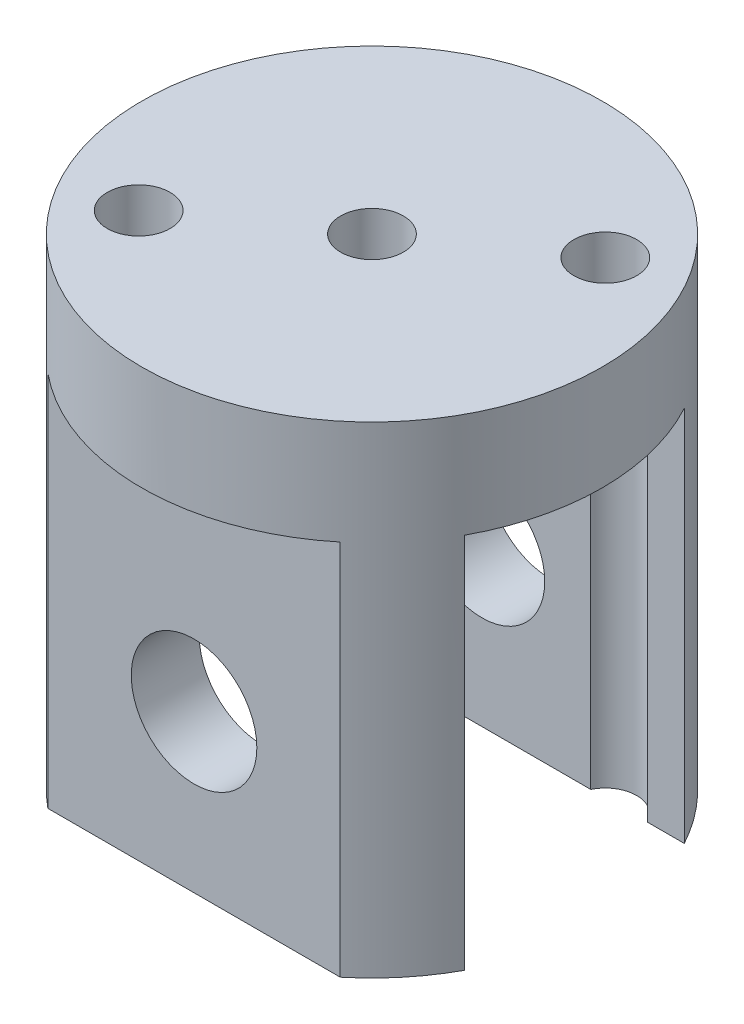
ISO-10303-21;
HEADER;
FILE_DESCRIPTION(('STEP AP214'),'2;1');
FILE_NAME('part.step','',(''),(''),'','','');
FILE_SCHEMA(('AUTOMOTIVE_DESIGN { 1 0 10303 214 1 1 1 1 }'));
ENDSEC;
DATA;
#1=APPLICATION_CONTEXT('core data for automotive mechanical design processes');
#2=APPLICATION_PROTOCOL_DEFINITION('international standard','automotive_design',2000,#1);
#3=PRODUCT_CONTEXT('',#1,'mechanical');
#4=PRODUCT('Part','Part','',(#3));
#5=PRODUCT_RELATED_PRODUCT_CATEGORY('part','',(#4));
#6=PRODUCT_DEFINITION_FORMATION('','',#4);
#7=PRODUCT_DEFINITION_CONTEXT('part definition',#1,'design');
#8=PRODUCT_DEFINITION('design','',#6,#7);
#9=PRODUCT_DEFINITION_SHAPE('','',#8);
#10=(LENGTH_UNIT() NAMED_UNIT(*) SI_UNIT(.MILLI.,.METRE.));
#11=(NAMED_UNIT(*) PLANE_ANGLE_UNIT() SI_UNIT($,.RADIAN.));
#12=(NAMED_UNIT(*) SI_UNIT($,.STERADIAN.) SOLID_ANGLE_UNIT());
#13=UNCERTAINTY_MEASURE_WITH_UNIT(LENGTH_MEASURE(1.E-05),#10,'distance_accuracy_value','');
#14=(GEOMETRIC_REPRESENTATION_CONTEXT(3) GLOBAL_UNCERTAINTY_ASSIGNED_CONTEXT((#13)) GLOBAL_UNIT_ASSIGNED_CONTEXT((#10,
#11,#12)) REPRESENTATION_CONTEXT('',''));
#15=CARTESIAN_POINT('',(0.,0.,0.));
#16=DIRECTION('',(0.,0.,1.));
#17=DIRECTION('',(1.,0.,0.));
#18=AXIS2_PLACEMENT_3D('',#15,#16,#17);
#19=CARTESIAN_POINT('',(0.,0.,-5.25));
#20=DIRECTION('',(0.,0.,-1.));
#21=DIRECTION('',(-1.,0.,0.));
#22=AXIS2_PLACEMENT_3D('',#19,#20,#21);
#23=PLANE('',#22);
#24=CARTESIAN_POINT('',(0.,7.5,-5.25));
#25=DIRECTION('',(0.,0.,-1.));
#26=DIRECTION('',(-1.,0.,0.));
#27=AXIS2_PLACEMENT_3D('',#24,#25,#26);
#28=CIRCLE('',#27,3.);
#29=CARTESIAN_POINT('',(-3.,7.5,-5.25));
#30=VERTEX_POINT('',#29);
#31=EDGE_CURVE('E168',#30,#30,#28,.T.);
#32=ORIENTED_EDGE('',*,*,#31,.T.);
#33=EDGE_LOOP('',(#32));
#34=FACE_BOUND('',#33,.T.);
#35=DIRECTION('',(-1.,0.,0.));
#36=VECTOR('',#35,1.);
#37=CARTESIAN_POINT('',(0.,0.,-5.25));
#38=LINE('',#37,#36);
#39=CARTESIAN_POINT('',(5.19803093457524,0.,-5.25));
#40=VERTEX_POINT('',#39);
#41=CARTESIAN_POINT('',(-9.6663074645906,0.,-5.25));
#42=VERTEX_POINT('',#41);
#43=EDGE_CURVE('E153',#40,#42,#38,.T.);
#44=ORIENTED_EDGE('',*,*,#43,.F.);
#45=DIRECTION('',(0.,1.,0.));
#46=VECTOR('',#45,1.);
#47=CARTESIAN_POINT('',(5.19803093457524,0.,-5.25));
#48=LINE('',#47,#46);
#49=CARTESIAN_POINT('',(5.19803093457524,18.,-5.25));
#50=VERTEX_POINT('',#49);
#51=EDGE_CURVE('E11',#40,#50,#48,.T.);
#52=ORIENTED_EDGE('',*,*,#51,.T.);
#53=DIRECTION('',(-1.,0.,0.));
#54=VECTOR('',#53,1.);
#55=CARTESIAN_POINT('',(-11.,18.,-5.25));
#56=LINE('',#55,#54);
#57=CARTESIAN_POINT('',(-9.6663074645906,18.,-5.25));
#58=VERTEX_POINT('',#57);
#59=EDGE_CURVE('E235',#50,#58,#56,.T.);
#60=ORIENTED_EDGE('',*,*,#59,.T.);
#61=DIRECTION('',(0.,-1.,0.));
#62=VECTOR('',#61,1.);
#63=CARTESIAN_POINT('',(-9.6663074645906,23.,-5.25));
#64=LINE('',#63,#62);
#65=EDGE_CURVE('E227',#42,#58,#64,.F.);
#66=ORIENTED_EDGE('',*,*,#65,.F.);
#67=EDGE_LOOP('',(#44,#52,#60,#66));
#68=FACE_BOUND('',#67,.T.);
#69=ADVANCED_FACE('F39',(#34,#68),#23,.F.);
#70=CARTESIAN_POINT('',(0.,0.,5.25));
#71=DIRECTION('',(0.,0.,-1.));
#72=DIRECTION('',(-1.,0.,0.));
#73=AXIS2_PLACEMENT_3D('',#70,#71,#72);
#74=PLANE('',#73);
#75=DIRECTION('',(0.,1.,0.));
#76=VECTOR('',#75,1.);
#77=CARTESIAN_POINT('',(-7.89794093729092,0.,5.25));
#78=LINE('',#77,#76);
#79=CARTESIAN_POINT('',(-7.89794093729092,0.,5.25));
#80=VERTEX_POINT('',#79);
#81=CARTESIAN_POINT('',(-7.89794093729092,18.,5.25));
#82=VERTEX_POINT('',#81);
#83=EDGE_CURVE('E135',#80,#82,#78,.T.);
#84=ORIENTED_EDGE('',*,*,#83,.F.);
#85=DIRECTION('',(-1.,0.,0.));
#86=VECTOR('',#85,1.);
#87=CARTESIAN_POINT('',(0.,0.,5.25));
#88=LINE('',#87,#86);
#89=CARTESIAN_POINT('',(-9.6663074645906,0.,5.25));
#90=VERTEX_POINT('',#89);
#91=EDGE_CURVE('E146',#80,#90,#88,.T.);
#92=ORIENTED_EDGE('',*,*,#91,.T.);
#93=DIRECTION('',(0.,-1.,0.));
#94=VECTOR('',#93,1.);
#95=CARTESIAN_POINT('',(-9.6663074645906,23.,5.25));
#96=LINE('',#95,#94);
#97=CARTESIAN_POINT('',(-9.6663074645906,18.,5.25));
#98=VERTEX_POINT('',#97);
#99=EDGE_CURVE('E230',#90,#98,#96,.F.);
#100=ORIENTED_EDGE('',*,*,#99,.T.);
#101=DIRECTION('',(-1.,0.,0.));
#102=VECTOR('',#101,1.);
#103=CARTESIAN_POINT('',(-11.,18.,5.25));
#104=LINE('',#103,#102);
#105=EDGE_CURVE('E236',#82,#98,#104,.T.);
#106=ORIENTED_EDGE('',*,*,#105,.F.);
#107=EDGE_LOOP('',(#84,#92,#100,#106));
#108=FACE_BOUND('',#107,.T.);
#109=ADVANCED_FACE('F295',(#108),#74,.T.);
#110=CARTESIAN_POINT('',(0.,0.,0.));
#111=DIRECTION('',(0.,1.,0.));
#112=DIRECTION('',(0.,0.,1.));
#113=AXIS2_PLACEMENT_3D('',#110,#111,#112);
#114=PLANE('',#113);
#115=ORIENTED_EDGE('',*,*,#91,.F.);
#116=CARTESIAN_POINT('',(-6.54798593593308,0.,4.59607225604892));
#117=DIRECTION('',(0.,1.,0.));
#118=DIRECTION('',(0.,0.,1.));
#119=AXIS2_PLACEMENT_3D('',#116,#117,#118);
#120=CIRCLE('',#119,1.5);
#121=CARTESIAN_POINT('',(-5.19803093457524,0.,5.25));
#122=VERTEX_POINT('',#121);
#123=EDGE_CURVE('E129',#80,#122,#120,.T.);
#124=ORIENTED_EDGE('',*,*,#123,.T.);
#125=CARTESIAN_POINT('',(9.6663074645906,0.,5.25));
#126=VERTEX_POINT('',#125);
#127=EDGE_CURVE('E143',#126,#122,#88,.T.);
#128=ORIENTED_EDGE('',*,*,#127,.F.);
#129=CARTESIAN_POINT('',(0.,0.,0.));
#130=DIRECTION('',(0.,1.,0.));
#131=DIRECTION('',(0.,0.,1.));
#132=AXIS2_PLACEMENT_3D('',#129,#130,#131);
#133=CIRCLE('',#132,11.);
#134=CARTESIAN_POINT('',(6.98212002188447,0.,8.5));
#135=VERTEX_POINT('',#134);
#136=EDGE_CURVE('E192',#135,#126,#133,.T.);
#137=ORIENTED_EDGE('',*,*,#136,.F.);
#138=DIRECTION('',(-1.,0.,0.));
#139=VECTOR('',#138,1.);
#140=CARTESIAN_POINT('',(0.,0.,8.5));
#141=LINE('',#140,#139);
#142=CARTESIAN_POINT('',(-6.98212002188447,0.,8.5));
#143=VERTEX_POINT('',#142);
#144=EDGE_CURVE('E281',#135,#143,#141,.T.);
#145=ORIENTED_EDGE('',*,*,#144,.T.);
#146=EDGE_CURVE('E195',#90,#143,#133,.T.);
#147=ORIENTED_EDGE('',*,*,#146,.F.);
#148=EDGE_LOOP('',(#115,#124,#128,#137,#145,#147));
#149=FACE_BOUND('',#148,.T.);
#150=ADVANCED_FACE('F141',(#149),#114,.F.);
#151=CARTESIAN_POINT('',(0.,23.,0.));
#152=DIRECTION('',(0.,-1.,0.));
#153=DIRECTION('',(0.,0.,-1.));
#154=AXIS2_PLACEMENT_3D('',#151,#152,#153);
#155=CYLINDRICAL_SURFACE('',#154,11.);
#156=CARTESIAN_POINT('',(0.,23.,0.));
#157=DIRECTION('',(0.,1.,0.));
#158=DIRECTION('',(0.,0.,1.));
#159=AXIS2_PLACEMENT_3D('',#156,#157,#158);
#160=CIRCLE('',#159,11.);
#161=CARTESIAN_POINT('',(0.,23.,11.));
#162=VERTEX_POINT('',#161);
#163=EDGE_CURVE('E206',#162,#162,#160,.T.);
#164=ORIENTED_EDGE('',*,*,#163,.F.);
#165=EDGE_LOOP('',(#164));
#166=FACE_BOUND('',#165,.T.);
#167=CARTESIAN_POINT('',(0.,18.,0.));
#168=DIRECTION('',(0.,1.,0.));
#169=DIRECTION('',(0.,0.,1.));
#170=AXIS2_PLACEMENT_3D('',#167,#168,#169);
#171=CIRCLE('',#170,11.);
#172=CARTESIAN_POINT('',(9.6663074645906,18.,5.25));
#173=VERTEX_POINT('',#172);
#174=CARTESIAN_POINT('',(9.6663074645906,18.,-5.25));
#175=VERTEX_POINT('',#174);
#176=EDGE_CURVE('E136',#173,#175,#171,.T.);
#177=ORIENTED_EDGE('',*,*,#176,.T.);
#178=DIRECTION('',(0.,-1.,0.));
#179=VECTOR('',#178,1.);
#180=CARTESIAN_POINT('',(9.6663074645906,23.,-5.25));
#181=LINE('',#180,#179);
#182=CARTESIAN_POINT('',(9.6663074645906,0.,-5.25));
#183=VERTEX_POINT('',#182);
#184=EDGE_CURVE('E225',#175,#183,#181,.T.);
#185=ORIENTED_EDGE('',*,*,#184,.T.);
#186=CARTESIAN_POINT('',(6.98212002188447,0.,-8.5));
#187=VERTEX_POINT('',#186);
#188=EDGE_CURVE('E186',#183,#187,#133,.T.);
#189=ORIENTED_EDGE('',*,*,#188,.T.);
#190=DIRECTION('',(0.,-1.,0.));
#191=VECTOR('',#190,1.);
#192=CARTESIAN_POINT('',(6.98212002188447,23.,-8.5));
#193=LINE('',#192,#191);
#194=CARTESIAN_POINT('',(6.98212002188447,18.,-8.5));
#195=VERTEX_POINT('',#194);
#196=EDGE_CURVE('E198',#187,#195,#193,.F.);
#197=ORIENTED_EDGE('',*,*,#196,.T.);
#198=CARTESIAN_POINT('',(0.,18.,0.));
#199=DIRECTION('',(0.,-1.,0.));
#200=DIRECTION('',(0.,0.,-1.));
#201=AXIS2_PLACEMENT_3D('',#198,#199,#200);
#202=CIRCLE('',#201,11.);
#203=CARTESIAN_POINT('',(-6.98212002188447,18.,-8.5));
#204=VERTEX_POINT('',#203);
#205=EDGE_CURVE('E211',#204,#195,#202,.T.);
#206=ORIENTED_EDGE('',*,*,#205,.F.);
#207=DIRECTION('',(0.,-1.,0.));
#208=VECTOR('',#207,1.);
#209=CARTESIAN_POINT('',(-6.98212002188447,23.,-8.5));
#210=LINE('',#209,#208);
#211=CARTESIAN_POINT('',(-6.98212002188447,0.,-8.5));
#212=VERTEX_POINT('',#211);
#213=EDGE_CURVE('E193',#204,#212,#210,.T.);
#214=ORIENTED_EDGE('',*,*,#213,.T.);
#215=EDGE_CURVE('E196',#212,#42,#133,.T.);
#216=ORIENTED_EDGE('',*,*,#215,.T.);
#217=ORIENTED_EDGE('',*,*,#65,.T.);
#218=EDGE_CURVE('E162',#58,#98,#171,.T.);
#219=ORIENTED_EDGE('',*,*,#218,.T.);
#220=ORIENTED_EDGE('',*,*,#99,.F.);
#221=ORIENTED_EDGE('',*,*,#146,.T.);
#222=DIRECTION('',(0.,-1.,0.));
#223=VECTOR('',#222,1.);
#224=CARTESIAN_POINT('',(-6.98212002188447,23.,8.5));
#225=LINE('',#224,#223);
#226=CARTESIAN_POINT('',(-6.98212002188447,18.,8.5));
#227=VERTEX_POINT('',#226);
#228=EDGE_CURVE('E220',#143,#227,#225,.F.);
#229=ORIENTED_EDGE('',*,*,#228,.T.);
#230=CARTESIAN_POINT('',(0.,18.,0.));
#231=DIRECTION('',(0.,-1.,0.));
#232=DIRECTION('',(0.,0.,-1.));
#233=AXIS2_PLACEMENT_3D('',#230,#231,#232);
#234=CIRCLE('',#233,11.);
#235=CARTESIAN_POINT('',(6.98212002188447,18.,8.5));
#236=VERTEX_POINT('',#235);
#237=EDGE_CURVE('E157',#236,#227,#234,.T.);
#238=ORIENTED_EDGE('',*,*,#237,.F.);
#239=DIRECTION('',(0.,-1.,0.));
#240=VECTOR('',#239,1.);
#241=CARTESIAN_POINT('',(6.98212002188447,23.,8.5));
#242=LINE('',#241,#240);
#243=EDGE_CURVE('E217',#236,#135,#242,.T.);
#244=ORIENTED_EDGE('',*,*,#243,.T.);
#245=ORIENTED_EDGE('',*,*,#136,.T.);
#246=DIRECTION('',(0.,-1.,0.));
#247=VECTOR('',#246,1.);
#248=CARTESIAN_POINT('',(9.6663074645906,23.,5.25));
#249=LINE('',#248,#247);
#250=EDGE_CURVE('E152',#173,#126,#249,.T.);
#251=ORIENTED_EDGE('',*,*,#250,.F.);
#252=EDGE_LOOP('',(#177,#185,#189,#197,#206,#214,#216,#217,#219,#220,#221,#229,#238,#244,#245,#251));
#253=FACE_BOUND('',#252,.T.);
#254=ADVANCED_FACE('F41',(#166,#253),#155,.T.);
#255=CARTESIAN_POINT('',(0.,23.,0.));
#256=DIRECTION('',(0.,1.,0.));
#257=DIRECTION('',(0.,0.,1.));
#258=AXIS2_PLACEMENT_3D('',#255,#256,#257);
#259=PLANE('',#258);
#260=CARTESIAN_POINT('',(-6.54798593593308,23.,4.59607225604892));
#261=DIRECTION('',(0.,1.,0.));
#262=DIRECTION('',(0.,0.,1.));
#263=AXIS2_PLACEMENT_3D('',#260,#261,#262);
#264=CIRCLE('',#263,1.5);
#265=CARTESIAN_POINT('',(-6.54798593593308,23.,6.09607225604892));
#266=VERTEX_POINT('',#265);
#267=EDGE_CURVE('E147',#266,#266,#264,.T.);
#268=ORIENTED_EDGE('',*,*,#267,.F.);
#269=EDGE_LOOP('',(#268));
#270=FACE_BOUND('',#269,.T.);
#271=CARTESIAN_POINT('',(6.54798593593308,23.,-4.59607225604892));
#272=DIRECTION('',(0.,1.,0.));
#273=DIRECTION('',(0.,0.,1.));
#274=AXIS2_PLACEMENT_3D('',#271,#272,#273);
#275=CIRCLE('',#274,1.5);
#276=CARTESIAN_POINT('',(6.54798593593308,23.,-3.09607225604892));
#277=VERTEX_POINT('',#276);
#278=EDGE_CURVE('E251',#277,#277,#275,.T.);
#279=ORIENTED_EDGE('',*,*,#278,.F.);
#280=EDGE_LOOP('',(#279));
#281=FACE_BOUND('',#280,.T.);
#282=CARTESIAN_POINT('',(0.,23.,0.));
#283=DIRECTION('',(0.,1.,0.));
#284=DIRECTION('',(0.,0.,1.));
#285=AXIS2_PLACEMENT_3D('',#282,#283,#284);
#286=CIRCLE('',#285,1.5);
#287=CARTESIAN_POINT('',(0.,23.,1.5));
#288=VERTEX_POINT('',#287);
#289=EDGE_CURVE('E172',#288,#288,#286,.T.);
#290=ORIENTED_EDGE('',*,*,#289,.F.);
#291=EDGE_LOOP('',(#290));
#292=FACE_BOUND('',#291,.T.);
#293=ORIENTED_EDGE('',*,*,#163,.T.);
#294=EDGE_LOOP('',(#293));
#295=FACE_BOUND('',#294,.T.);
#296=ADVANCED_FACE('F257',(#270,#281,#292,#295),#259,.T.);
#297=CARTESIAN_POINT('',(7.89794093729093,0.,-5.25));
#298=VERTEX_POINT('',#297);
#299=EDGE_CURVE('E155',#183,#298,#38,.T.);
#300=ORIENTED_EDGE('',*,*,#299,.T.);
#301=CARTESIAN_POINT('',(6.54798593593308,0.,-4.59607225604892));
#302=DIRECTION('',(0.,1.,0.));
#303=DIRECTION('',(0.,0.,1.));
#304=AXIS2_PLACEMENT_3D('',#301,#302,#303);
#305=CIRCLE('',#304,1.5);
#306=EDGE_CURVE('E54',#298,#40,#305,.T.);
#307=ORIENTED_EDGE('',*,*,#306,.T.);
#308=ORIENTED_EDGE('',*,*,#43,.T.);
#309=ORIENTED_EDGE('',*,*,#215,.F.);
#310=DIRECTION('',(1.,0.,0.));
#311=VECTOR('',#310,1.);
#312=CARTESIAN_POINT('',(0.,0.,-8.5));
#313=LINE('',#312,#311);
#314=EDGE_CURVE('E188',#212,#187,#313,.T.);
#315=ORIENTED_EDGE('',*,*,#314,.T.);
#316=ORIENTED_EDGE('',*,*,#188,.F.);
#317=EDGE_LOOP('',(#300,#307,#308,#309,#315,#316));
#318=FACE_BOUND('',#317,.T.);
#319=ADVANCED_FACE('F183',(#318),#114,.F.);
#320=CARTESIAN_POINT('',(-11.,18.,-11.));
#321=DIRECTION('',(0.,-1.,0.));
#322=DIRECTION('',(0.,0.,-1.));
#323=AXIS2_PLACEMENT_3D('',#320,#321,#322);
#324=PLANE('',#323);
#325=ORIENTED_EDGE('',*,*,#205,.T.);
#326=DIRECTION('',(1.,0.,0.));
#327=VECTOR('',#326,1.);
#328=CARTESIAN_POINT('',(-11.,18.,-8.5));
#329=LINE('',#328,#327);
#330=EDGE_CURVE('E214',#204,#195,#329,.T.);
#331=ORIENTED_EDGE('',*,*,#330,.F.);
#332=EDGE_LOOP('',(#325,#331));
#333=FACE_BOUND('',#332,.T.);
#334=ADVANCED_FACE('F286',(#333),#324,.T.);
#335=CARTESIAN_POINT('',(0.,0.,-8.5));
#336=DIRECTION('',(0.,0.,1.));
#337=DIRECTION('',(1.,0.,0.));
#338=AXIS2_PLACEMENT_3D('',#335,#336,#337);
#339=PLANE('',#338);
#340=CARTESIAN_POINT('',(0.,7.5,-8.5));
#341=DIRECTION('',(0.,0.,1.));
#342=DIRECTION('',(1.,0.,0.));
#343=AXIS2_PLACEMENT_3D('',#340,#341,#342);
#344=CIRCLE('',#343,3.);
#345=CARTESIAN_POINT('',(3.,7.5,-8.5));
#346=VERTEX_POINT('',#345);
#347=EDGE_CURVE('E238',#346,#346,#344,.T.);
#348=ORIENTED_EDGE('',*,*,#347,.T.);
#349=EDGE_LOOP('',(#348));
#350=FACE_BOUND('',#349,.T.);
#351=ORIENTED_EDGE('',*,*,#330,.T.);
#352=ORIENTED_EDGE('',*,*,#196,.F.);
#353=ORIENTED_EDGE('',*,*,#314,.F.);
#354=ORIENTED_EDGE('',*,*,#213,.F.);
#355=EDGE_LOOP('',(#351,#352,#353,#354));
#356=FACE_BOUND('',#355,.T.);
#357=ADVANCED_FACE('F289',(#350,#356),#339,.F.);
#358=CARTESIAN_POINT('',(-11.,18.,11.));
#359=DIRECTION('',(0.,-1.,0.));
#360=DIRECTION('',(0.,0.,-1.));
#361=AXIS2_PLACEMENT_3D('',#358,#359,#360);
#362=PLANE('',#361);
#363=DIRECTION('',(-1.,0.,0.));
#364=VECTOR('',#363,1.);
#365=CARTESIAN_POINT('',(-11.,18.,8.5));
#366=LINE('',#365,#364);
#367=EDGE_CURVE('E222',#236,#227,#366,.T.);
#368=ORIENTED_EDGE('',*,*,#367,.F.);
#369=ORIENTED_EDGE('',*,*,#237,.T.);
#370=EDGE_LOOP('',(#368,#369));
#371=FACE_BOUND('',#370,.T.);
#372=ADVANCED_FACE('F404',(#371),#362,.T.);
#373=CARTESIAN_POINT('',(0.,0.,8.5));
#374=DIRECTION('',(0.,0.,-1.));
#375=DIRECTION('',(-1.,0.,0.));
#376=AXIS2_PLACEMENT_3D('',#373,#374,#375);
#377=PLANE('',#376);
#378=CARTESIAN_POINT('',(0.,7.5,8.5));
#379=DIRECTION('',(0.,0.,1.));
#380=DIRECTION('',(1.,0.,0.));
#381=AXIS2_PLACEMENT_3D('',#378,#379,#380);
#382=CIRCLE('',#381,3.);
#383=CARTESIAN_POINT('',(3.,7.5,8.5));
#384=VERTEX_POINT('',#383);
#385=EDGE_CURVE('E169',#384,#384,#382,.T.);
#386=ORIENTED_EDGE('',*,*,#385,.F.);
#387=EDGE_LOOP('',(#386));
#388=FACE_BOUND('',#387,.T.);
#389=ORIENTED_EDGE('',*,*,#367,.T.);
#390=ORIENTED_EDGE('',*,*,#228,.F.);
#391=ORIENTED_EDGE('',*,*,#144,.F.);
#392=ORIENTED_EDGE('',*,*,#243,.F.);
#393=EDGE_LOOP('',(#389,#390,#391,#392));
#394=FACE_BOUND('',#393,.T.);
#395=ADVANCED_FACE('F275',(#388,#394),#377,.F.);
#396=CARTESIAN_POINT('',(-11.,18.,-5.25));
#397=DIRECTION('',(0.,1.,0.));
#398=DIRECTION('',(0.,0.,1.));
#399=AXIS2_PLACEMENT_3D('',#396,#397,#398);
#400=PLANE('',#399);
#401=CARTESIAN_POINT('',(0.,18.,0.));
#402=DIRECTION('',(0.,1.,0.));
#403=DIRECTION('',(0.,0.,1.));
#404=AXIS2_PLACEMENT_3D('',#401,#402,#403);
#405=CIRCLE('',#404,1.5);
#406=CARTESIAN_POINT('',(0.,18.,1.5));
#407=VERTEX_POINT('',#406);
#408=EDGE_CURVE('E170',#407,#407,#405,.T.);
#409=ORIENTED_EDGE('',*,*,#408,.T.);
#410=EDGE_LOOP('',(#409));
#411=FACE_BOUND('',#410,.T.);
#412=CARTESIAN_POINT('',(-5.19803093457524,18.,5.25));
#413=VERTEX_POINT('',#412);
#414=EDGE_CURVE('E233',#173,#413,#104,.T.);
#415=ORIENTED_EDGE('',*,*,#414,.T.);
#416=CARTESIAN_POINT('',(-6.54798593593308,18.,4.59607225604892));
#417=DIRECTION('',(0.,1.,0.));
#418=DIRECTION('',(0.,0.,1.));
#419=AXIS2_PLACEMENT_3D('',#416,#417,#418);
#420=CIRCLE('',#419,1.5);
#421=EDGE_CURVE('E62',#413,#82,#420,.T.);
#422=ORIENTED_EDGE('',*,*,#421,.T.);
#423=ORIENTED_EDGE('',*,*,#105,.T.);
#424=ORIENTED_EDGE('',*,*,#218,.F.);
#425=ORIENTED_EDGE('',*,*,#59,.F.);
#426=CARTESIAN_POINT('',(6.54798593593308,18.,-4.59607225604892));
#427=DIRECTION('',(0.,1.,0.));
#428=DIRECTION('',(0.,0.,1.));
#429=AXIS2_PLACEMENT_3D('',#426,#427,#428);
#430=CIRCLE('',#429,1.5);
#431=CARTESIAN_POINT('',(7.89794093729093,18.,-5.25));
#432=VERTEX_POINT('',#431);
#433=EDGE_CURVE('E247',#50,#432,#430,.T.);
#434=ORIENTED_EDGE('',*,*,#433,.T.);
#435=EDGE_CURVE('E179',#175,#432,#56,.T.);
#436=ORIENTED_EDGE('',*,*,#435,.F.);
#437=ORIENTED_EDGE('',*,*,#176,.F.);
#438=EDGE_LOOP('',(#415,#422,#423,#424,#425,#434,#436,#437));
#439=FACE_BOUND('',#438,.T.);
#440=ADVANCED_FACE('F272',(#411,#439),#400,.F.);
#441=ORIENTED_EDGE('',*,*,#435,.T.);
#442=DIRECTION('',(0.,1.,0.));
#443=VECTOR('',#442,1.);
#444=CARTESIAN_POINT('',(7.89794093729093,0.,-5.25));
#445=LINE('',#444,#443);
#446=EDGE_CURVE('E47',#432,#298,#445,.F.);
#447=ORIENTED_EDGE('',*,*,#446,.T.);
#448=ORIENTED_EDGE('',*,*,#299,.F.);
#449=ORIENTED_EDGE('',*,*,#184,.F.);
#450=EDGE_LOOP('',(#441,#447,#448,#449));
#451=FACE_BOUND('',#450,.T.);
#452=ADVANCED_FACE('F176',(#451),#23,.F.);
#453=DIRECTION('',(0.,1.,0.));
#454=VECTOR('',#453,1.);
#455=CARTESIAN_POINT('',(-5.19803093457524,0.,5.25));
#456=LINE('',#455,#454);
#457=EDGE_CURVE('E125',#413,#122,#456,.F.);
#458=ORIENTED_EDGE('',*,*,#457,.F.);
#459=ORIENTED_EDGE('',*,*,#414,.F.);
#460=ORIENTED_EDGE('',*,*,#250,.T.);
#461=ORIENTED_EDGE('',*,*,#127,.T.);
#462=EDGE_LOOP('',(#458,#459,#460,#461));
#463=FACE_BOUND('',#462,.T.);
#464=CARTESIAN_POINT('',(0.,7.5,5.25));
#465=DIRECTION('',(0.,0.,-1.));
#466=DIRECTION('',(-1.,0.,0.));
#467=AXIS2_PLACEMENT_3D('',#464,#465,#466);
#468=CIRCLE('',#467,3.);
#469=CARTESIAN_POINT('',(-3.,7.5,5.25));
#470=VERTEX_POINT('',#469);
#471=EDGE_CURVE('E165',#470,#470,#468,.T.);
#472=ORIENTED_EDGE('',*,*,#471,.F.);
#473=EDGE_LOOP('',(#472));
#474=FACE_BOUND('',#473,.T.);
#475=ADVANCED_FACE('F149',(#463,#474),#74,.T.);
#476=CARTESIAN_POINT('',(0.,7.5,-11.));
#477=DIRECTION('',(0.,0.,1.));
#478=DIRECTION('',(1.,0.,0.));
#479=AXIS2_PLACEMENT_3D('',#476,#477,#478);
#480=CYLINDRICAL_SURFACE('',#479,3.);
#481=ORIENTED_EDGE('',*,*,#471,.T.);
#482=EDGE_LOOP('',(#481));
#483=FACE_BOUND('',#482,.T.);
#484=ORIENTED_EDGE('',*,*,#385,.T.);
#485=EDGE_LOOP('',(#484));
#486=FACE_BOUND('',#485,.T.);
#487=ADVANCED_FACE('F305',(#483,#486),#480,.F.);
#488=ORIENTED_EDGE('',*,*,#31,.F.);
#489=EDGE_LOOP('',(#488));
#490=FACE_BOUND('',#489,.T.);
#491=ORIENTED_EDGE('',*,*,#347,.F.);
#492=EDGE_LOOP('',(#491));
#493=FACE_BOUND('',#492,.T.);
#494=ADVANCED_FACE('F268',(#490,#493),#480,.F.);
#495=CARTESIAN_POINT('',(0.,0.,0.));
#496=DIRECTION('',(0.,1.,0.));
#497=DIRECTION('',(0.,0.,1.));
#498=AXIS2_PLACEMENT_3D('',#495,#496,#497);
#499=CYLINDRICAL_SURFACE('',#498,1.5);
#500=ORIENTED_EDGE('',*,*,#289,.T.);
#501=EDGE_LOOP('',(#500));
#502=FACE_BOUND('',#501,.T.);
#503=ORIENTED_EDGE('',*,*,#408,.F.);
#504=EDGE_LOOP('',(#503));
#505=FACE_BOUND('',#504,.T.);
#506=ADVANCED_FACE('F265',(#502,#505),#499,.F.);
#507=CARTESIAN_POINT('',(-6.54798593593308,0.,4.59607225604892));
#508=DIRECTION('',(0.,1.,0.));
#509=DIRECTION('',(0.,0.,1.));
#510=AXIS2_PLACEMENT_3D('',#507,#508,#509);
#511=CYLINDRICAL_SURFACE('',#510,1.5);
#512=ORIENTED_EDGE('',*,*,#83,.T.);
#513=ORIENTED_EDGE('',*,*,#421,.F.);
#514=ORIENTED_EDGE('',*,*,#457,.T.);
#515=ORIENTED_EDGE('',*,*,#123,.F.);
#516=EDGE_LOOP('',(#512,#513,#514,#515));
#517=FACE_BOUND('',#516,.T.);
#518=ORIENTED_EDGE('',*,*,#267,.T.);
#519=EDGE_LOOP('',(#518));
#520=FACE_BOUND('',#519,.T.);
#521=ADVANCED_FACE('F127',(#517,#520),#511,.F.);
#522=CARTESIAN_POINT('',(6.54798593593308,0.,-4.59607225604892));
#523=DIRECTION('',(0.,1.,0.));
#524=DIRECTION('',(0.,0.,1.));
#525=AXIS2_PLACEMENT_3D('',#522,#523,#524);
#526=CYLINDRICAL_SURFACE('',#525,1.5);
#527=ORIENTED_EDGE('',*,*,#278,.T.);
#528=EDGE_LOOP('',(#527));
#529=FACE_BOUND('',#528,.T.);
#530=ORIENTED_EDGE('',*,*,#306,.F.);
#531=ORIENTED_EDGE('',*,*,#446,.F.);
#532=ORIENTED_EDGE('',*,*,#433,.F.);
#533=ORIENTED_EDGE('',*,*,#51,.F.);
#534=EDGE_LOOP('',(#530,#531,#532,#533));
#535=FACE_BOUND('',#534,.T.);
#536=ADVANCED_FACE('F315',(#529,#535),#526,.F.);
#537=CLOSED_SHELL('',(#69,#109,#150,#254,#296,#319,#334,#357,#372,#395,#440,#452,#475,#487,#494,
#506,#521,#536));
#538=MANIFOLD_SOLID_BREP('B2',#537);
#539=ADVANCED_BREP_SHAPE_REPRESENTATION('',(#18,#538),#14);
#540=SHAPE_DEFINITION_REPRESENTATION(#9,#539);
ENDSEC;
END-ISO-10303-21;
